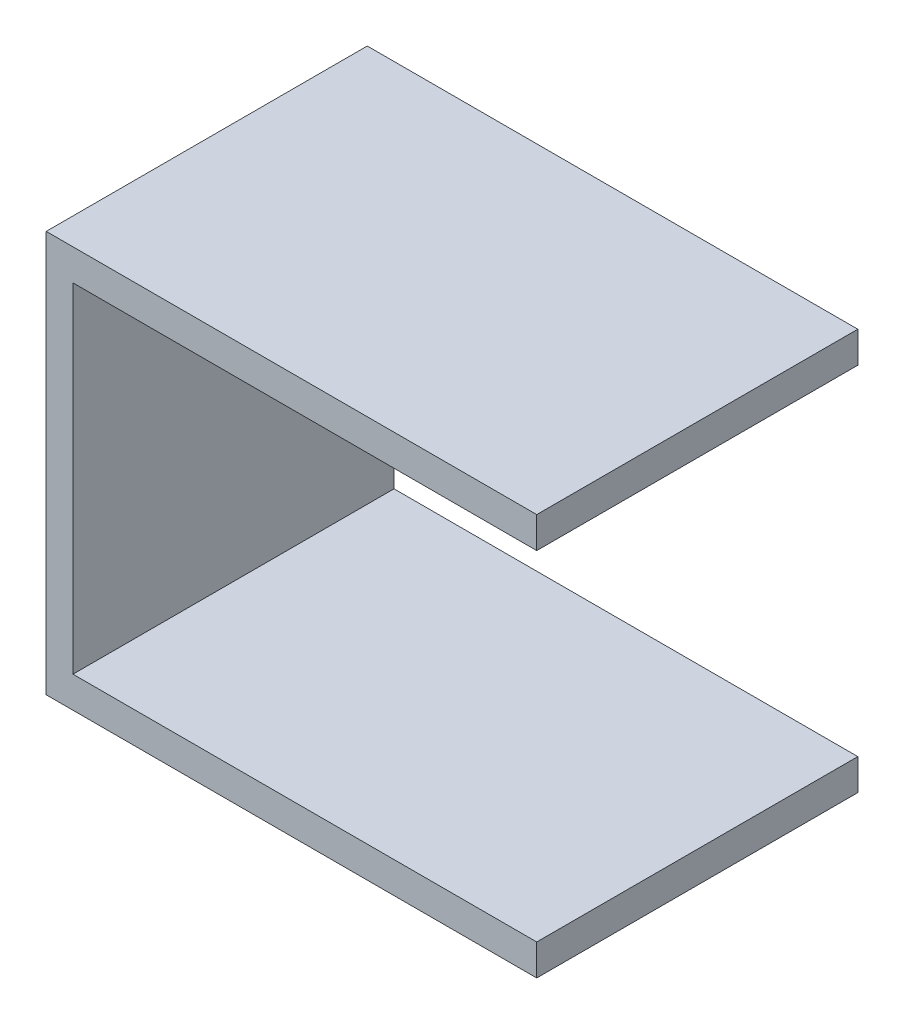
ISO-10303-21;
HEADER;
FILE_DESCRIPTION(('STEP AP214'),'2;1');
FILE_NAME('part.step','',(''),(''),'','','');
FILE_SCHEMA(('AUTOMOTIVE_DESIGN { 1 0 10303 214 1 1 1 1 }'));
ENDSEC;
DATA;
#1=APPLICATION_CONTEXT('core data for automotive mechanical design processes');
#2=APPLICATION_PROTOCOL_DEFINITION('international standard','automotive_design',2000,#1);
#3=PRODUCT_CONTEXT('',#1,'mechanical');
#4=PRODUCT('Part','Part','',(#3));
#5=PRODUCT_RELATED_PRODUCT_CATEGORY('part','',(#4));
#6=PRODUCT_DEFINITION_FORMATION('','',#4);
#7=PRODUCT_DEFINITION_CONTEXT('part definition',#1,'design');
#8=PRODUCT_DEFINITION('design','',#6,#7);
#9=PRODUCT_DEFINITION_SHAPE('','',#8);
#10=(LENGTH_UNIT() NAMED_UNIT(*) SI_UNIT(.MILLI.,.METRE.));
#11=(NAMED_UNIT(*) PLANE_ANGLE_UNIT() SI_UNIT($,.RADIAN.));
#12=(NAMED_UNIT(*) SI_UNIT($,.STERADIAN.) SOLID_ANGLE_UNIT());
#13=UNCERTAINTY_MEASURE_WITH_UNIT(LENGTH_MEASURE(1.E-05),#10,'distance_accuracy_value','');
#14=(GEOMETRIC_REPRESENTATION_CONTEXT(3) GLOBAL_UNCERTAINTY_ASSIGNED_CONTEXT((#13)) GLOBAL_UNIT_ASSIGNED_CONTEXT((#10,
#11,#12)) REPRESENTATION_CONTEXT('',''));
#15=CARTESIAN_POINT('',(0.,0.,0.));
#16=DIRECTION('',(0.,0.,1.));
#17=DIRECTION('',(1.,0.,0.));
#18=AXIS2_PLACEMENT_3D('',#15,#16,#17);
#19=CARTESIAN_POINT('',(0.,0.,36.));
#20=DIRECTION('',(0.,1.,0.));
#21=DIRECTION('',(0.,0.,1.));
#22=AXIS2_PLACEMENT_3D('',#19,#20,#21);
#23=PLANE('',#22);
#24=DIRECTION('',(1.,0.,0.));
#25=VECTOR('',#24,1.);
#26=CARTESIAN_POINT('',(0.,0.,0.));
#27=LINE('',#26,#25);
#28=CARTESIAN_POINT('',(-3.,0.,0.));
#29=VERTEX_POINT('',#28);
#30=CARTESIAN_POINT('',(52.,0.,0.));
#31=VERTEX_POINT('',#30);
#32=EDGE_CURVE('E89',#29,#31,#27,.T.);
#33=ORIENTED_EDGE('',*,*,#32,.T.);
#34=DIRECTION('',(0.,0.,-1.));
#35=VECTOR('',#34,1.);
#36=CARTESIAN_POINT('',(52.,0.,36.));
#37=LINE('',#36,#35);
#38=CARTESIAN_POINT('',(52.,0.,36.));
#39=VERTEX_POINT('',#38);
#40=EDGE_CURVE('E11',#39,#31,#37,.T.);
#41=ORIENTED_EDGE('',*,*,#40,.F.);
#42=DIRECTION('',(1.,0.,0.));
#43=VECTOR('',#42,1.);
#44=CARTESIAN_POINT('',(-3.,0.,36.));
#45=LINE('',#44,#43);
#46=CARTESIAN_POINT('',(-3.,0.,36.));
#47=VERTEX_POINT('',#46);
#48=EDGE_CURVE('E95',#47,#39,#45,.T.);
#49=ORIENTED_EDGE('',*,*,#48,.F.);
#50=DIRECTION('',(0.,0.,-1.));
#51=VECTOR('',#50,1.);
#52=CARTESIAN_POINT('',(-3.,0.,36.));
#53=LINE('',#52,#51);
#54=EDGE_CURVE('E129',#47,#29,#53,.T.);
#55=ORIENTED_EDGE('',*,*,#54,.T.);
#56=EDGE_LOOP('',(#33,#41,#49,#55));
#57=FACE_BOUND('',#56,.T.);
#58=ADVANCED_FACE('F37',(#57),#23,.F.);
#59=CARTESIAN_POINT('',(52.,0.,36.));
#60=DIRECTION('',(-1.,0.,0.));
#61=DIRECTION('',(0.,0.,1.));
#62=AXIS2_PLACEMENT_3D('',#59,#60,#61);
#63=PLANE('',#62);
#64=DIRECTION('',(0.,1.,0.));
#65=VECTOR('',#64,1.);
#66=CARTESIAN_POINT('',(52.,0.,0.));
#67=LINE('',#66,#65);
#68=CARTESIAN_POINT('',(52.,3.5,0.));
#69=VERTEX_POINT('',#68);
#70=EDGE_CURVE('E134',#31,#69,#67,.T.);
#71=ORIENTED_EDGE('',*,*,#70,.T.);
#72=DIRECTION('',(0.,0.,-1.));
#73=VECTOR('',#72,1.);
#74=CARTESIAN_POINT('',(52.,3.5,36.));
#75=LINE('',#74,#73);
#76=CARTESIAN_POINT('',(52.,3.5,36.));
#77=VERTEX_POINT('',#76);
#78=EDGE_CURVE('E45',#77,#69,#75,.T.);
#79=ORIENTED_EDGE('',*,*,#78,.F.);
#80=DIRECTION('',(0.,1.,0.));
#81=VECTOR('',#80,1.);
#82=CARTESIAN_POINT('',(52.,0.,36.));
#83=LINE('',#82,#81);
#84=EDGE_CURVE('E178',#39,#77,#83,.T.);
#85=ORIENTED_EDGE('',*,*,#84,.F.);
#86=ORIENTED_EDGE('',*,*,#40,.T.);
#87=EDGE_LOOP('',(#71,#79,#85,#86));
#88=FACE_BOUND('',#87,.T.);
#89=ADVANCED_FACE('F180',(#88),#63,.F.);
#90=CARTESIAN_POINT('',(52.,3.5,36.));
#91=DIRECTION('',(0.,-1.,0.));
#92=DIRECTION('',(1.,0.,0.));
#93=AXIS2_PLACEMENT_3D('',#90,#91,#92);
#94=PLANE('',#93);
#95=DIRECTION('',(-1.,0.,0.));
#96=VECTOR('',#95,1.);
#97=CARTESIAN_POINT('',(52.,3.5,0.));
#98=LINE('',#97,#96);
#99=CARTESIAN_POINT('',(0.,3.49999999999999,0.));
#100=VERTEX_POINT('',#99);
#101=EDGE_CURVE('E136',#69,#100,#98,.T.);
#102=ORIENTED_EDGE('',*,*,#101,.T.);
#103=DIRECTION('',(0.,0.,-1.));
#104=VECTOR('',#103,1.);
#105=CARTESIAN_POINT('',(0.,3.49999999999999,36.));
#106=LINE('',#105,#104);
#107=CARTESIAN_POINT('',(0.,3.49999999999999,36.));
#108=VERTEX_POINT('',#107);
#109=EDGE_CURVE('E153',#108,#100,#106,.T.);
#110=ORIENTED_EDGE('',*,*,#109,.F.);
#111=DIRECTION('',(-1.,0.,0.));
#112=VECTOR('',#111,1.);
#113=CARTESIAN_POINT('',(52.,3.5,36.));
#114=LINE('',#113,#112);
#115=EDGE_CURVE('E162',#77,#108,#114,.T.);
#116=ORIENTED_EDGE('',*,*,#115,.F.);
#117=ORIENTED_EDGE('',*,*,#78,.T.);
#118=EDGE_LOOP('',(#102,#110,#116,#117));
#119=FACE_BOUND('',#118,.T.);
#120=ADVANCED_FACE('F160',(#119),#94,.F.);
#121=CARTESIAN_POINT('',(0.,3.49999999999999,36.));
#122=DIRECTION('',(-1.,0.,0.));
#123=DIRECTION('',(0.,0.,1.));
#124=AXIS2_PLACEMENT_3D('',#121,#122,#123);
#125=PLANE('',#124);
#126=DIRECTION('',(0.,1.,0.));
#127=VECTOR('',#126,1.);
#128=CARTESIAN_POINT('',(0.,3.49999999999999,0.));
#129=LINE('',#128,#127);
#130=CARTESIAN_POINT('',(0.,41.5,0.));
#131=VERTEX_POINT('',#130);
#132=EDGE_CURVE('E138',#100,#131,#129,.T.);
#133=ORIENTED_EDGE('',*,*,#132,.T.);
#134=DIRECTION('',(0.,0.,-1.));
#135=VECTOR('',#134,1.);
#136=CARTESIAN_POINT('',(0.,41.5,36.));
#137=LINE('',#136,#135);
#138=CARTESIAN_POINT('',(0.,41.5,36.));
#139=VERTEX_POINT('',#138);
#140=EDGE_CURVE('E150',#139,#131,#137,.T.);
#141=ORIENTED_EDGE('',*,*,#140,.F.);
#142=DIRECTION('',(0.,1.,0.));
#143=VECTOR('',#142,1.);
#144=CARTESIAN_POINT('',(0.,3.49999999999999,36.));
#145=LINE('',#144,#143);
#146=EDGE_CURVE('E174',#108,#139,#145,.T.);
#147=ORIENTED_EDGE('',*,*,#146,.F.);
#148=ORIENTED_EDGE('',*,*,#109,.T.);
#149=EDGE_LOOP('',(#133,#141,#147,#148));
#150=FACE_BOUND('',#149,.T.);
#151=ADVANCED_FACE('F170',(#150),#125,.F.);
#152=CARTESIAN_POINT('',(0.,41.5,36.));
#153=DIRECTION('',(0.,1.,0.));
#154=DIRECTION('',(-1.,0.,0.));
#155=AXIS2_PLACEMENT_3D('',#152,#153,#154);
#156=PLANE('',#155);
#157=DIRECTION('',(1.,0.,0.));
#158=VECTOR('',#157,1.);
#159=CARTESIAN_POINT('',(0.,41.5,0.));
#160=LINE('',#159,#158);
#161=CARTESIAN_POINT('',(52.,41.5,0.));
#162=VERTEX_POINT('',#161);
#163=EDGE_CURVE('E140',#131,#162,#160,.T.);
#164=ORIENTED_EDGE('',*,*,#163,.T.);
#165=DIRECTION('',(0.,0.,-1.));
#166=VECTOR('',#165,1.);
#167=CARTESIAN_POINT('',(52.,41.5,36.));
#168=LINE('',#167,#166);
#169=CARTESIAN_POINT('',(52.,41.5,36.));
#170=VERTEX_POINT('',#169);
#171=EDGE_CURVE('E124',#170,#162,#168,.T.);
#172=ORIENTED_EDGE('',*,*,#171,.F.);
#173=DIRECTION('',(1.,0.,0.));
#174=VECTOR('',#173,1.);
#175=CARTESIAN_POINT('',(0.,41.5,36.));
#176=LINE('',#175,#174);
#177=EDGE_CURVE('E115',#139,#170,#176,.T.);
#178=ORIENTED_EDGE('',*,*,#177,.F.);
#179=ORIENTED_EDGE('',*,*,#140,.T.);
#180=EDGE_LOOP('',(#164,#172,#178,#179));
#181=FACE_BOUND('',#180,.T.);
#182=ADVANCED_FACE('F173',(#181),#156,.F.);
#183=CARTESIAN_POINT('',(52.,41.5,36.));
#184=DIRECTION('',(-1.,0.,0.));
#185=DIRECTION('',(0.,0.,1.));
#186=AXIS2_PLACEMENT_3D('',#183,#184,#185);
#187=PLANE('',#186);
#188=DIRECTION('',(0.,1.,0.));
#189=VECTOR('',#188,1.);
#190=CARTESIAN_POINT('',(52.,41.5,0.));
#191=LINE('',#190,#189);
#192=CARTESIAN_POINT('',(52.,45.,0.));
#193=VERTEX_POINT('',#192);
#194=EDGE_CURVE('E123',#162,#193,#191,.T.);
#195=ORIENTED_EDGE('',*,*,#194,.T.);
#196=DIRECTION('',(0.,0.,-1.));
#197=VECTOR('',#196,1.);
#198=CARTESIAN_POINT('',(52.,45.,36.));
#199=LINE('',#198,#197);
#200=CARTESIAN_POINT('',(52.,45.,36.));
#201=VERTEX_POINT('',#200);
#202=EDGE_CURVE('E120',#201,#193,#199,.T.);
#203=ORIENTED_EDGE('',*,*,#202,.F.);
#204=DIRECTION('',(0.,1.,0.));
#205=VECTOR('',#204,1.);
#206=CARTESIAN_POINT('',(52.,41.5,36.));
#207=LINE('',#206,#205);
#208=EDGE_CURVE('E109',#170,#201,#207,.T.);
#209=ORIENTED_EDGE('',*,*,#208,.F.);
#210=ORIENTED_EDGE('',*,*,#171,.T.);
#211=EDGE_LOOP('',(#195,#203,#209,#210));
#212=FACE_BOUND('',#211,.T.);
#213=ADVANCED_FACE('F121',(#212),#187,.F.);
#214=CARTESIAN_POINT('',(52.,45.,36.));
#215=DIRECTION('',(0.,-1.,0.));
#216=DIRECTION('',(1.,0.,0.));
#217=AXIS2_PLACEMENT_3D('',#214,#215,#216);
#218=PLANE('',#217);
#219=DIRECTION('',(-1.,0.,0.));
#220=VECTOR('',#219,1.);
#221=CARTESIAN_POINT('',(52.,45.,0.));
#222=LINE('',#221,#220);
#223=CARTESIAN_POINT('',(-3.,45.,0.));
#224=VERTEX_POINT('',#223);
#225=EDGE_CURVE('E82',#193,#224,#222,.T.);
#226=ORIENTED_EDGE('',*,*,#225,.T.);
#227=DIRECTION('',(0.,0.,-1.));
#228=VECTOR('',#227,1.);
#229=CARTESIAN_POINT('',(-3.,45.,36.));
#230=LINE('',#229,#228);
#231=CARTESIAN_POINT('',(-3.,45.,36.));
#232=VERTEX_POINT('',#231);
#233=EDGE_CURVE('E125',#232,#224,#230,.T.);
#234=ORIENTED_EDGE('',*,*,#233,.F.);
#235=DIRECTION('',(-1.,0.,0.));
#236=VECTOR('',#235,1.);
#237=CARTESIAN_POINT('',(52.,45.,36.));
#238=LINE('',#237,#236);
#239=EDGE_CURVE('E113',#201,#232,#238,.T.);
#240=ORIENTED_EDGE('',*,*,#239,.F.);
#241=ORIENTED_EDGE('',*,*,#202,.T.);
#242=EDGE_LOOP('',(#226,#234,#240,#241));
#243=FACE_BOUND('',#242,.T.);
#244=ADVANCED_FACE('F127',(#243),#218,.F.);
#245=CARTESIAN_POINT('',(-3.,45.,36.));
#246=DIRECTION('',(1.,0.,0.));
#247=DIRECTION('',(0.,1.,0.));
#248=AXIS2_PLACEMENT_3D('',#245,#246,#247);
#249=PLANE('',#248);
#250=DIRECTION('',(0.,-1.,0.));
#251=VECTOR('',#250,1.);
#252=CARTESIAN_POINT('',(-3.,45.,0.));
#253=LINE('',#252,#251);
#254=EDGE_CURVE('E144',#224,#29,#253,.T.);
#255=ORIENTED_EDGE('',*,*,#254,.T.);
#256=ORIENTED_EDGE('',*,*,#54,.F.);
#257=DIRECTION('',(0.,-1.,0.));
#258=VECTOR('',#257,1.);
#259=CARTESIAN_POINT('',(-3.,45.,36.));
#260=LINE('',#259,#258);
#261=EDGE_CURVE('E53',#232,#47,#260,.T.);
#262=ORIENTED_EDGE('',*,*,#261,.F.);
#263=ORIENTED_EDGE('',*,*,#233,.T.);
#264=EDGE_LOOP('',(#255,#256,#262,#263));
#265=FACE_BOUND('',#264,.T.);
#266=ADVANCED_FACE('F183',(#265),#249,.F.);
#267=CARTESIAN_POINT('',(0.,0.,36.));
#268=DIRECTION('',(0.,0.,1.));
#269=DIRECTION('',(1.,0.,0.));
#270=AXIS2_PLACEMENT_3D('',#267,#268,#269);
#271=PLANE('',#270);
#272=ORIENTED_EDGE('',*,*,#48,.T.);
#273=ORIENTED_EDGE('',*,*,#84,.T.);
#274=ORIENTED_EDGE('',*,*,#115,.T.);
#275=ORIENTED_EDGE('',*,*,#146,.T.);
#276=ORIENTED_EDGE('',*,*,#177,.T.);
#277=ORIENTED_EDGE('',*,*,#208,.T.);
#278=ORIENTED_EDGE('',*,*,#239,.T.);
#279=ORIENTED_EDGE('',*,*,#261,.T.);
#280=EDGE_LOOP('',(#272,#273,#274,#275,#276,#277,#278,#279));
#281=FACE_BOUND('',#280,.T.);
#282=ADVANCED_FACE('F111',(#281),#271,.T.);
#283=CARTESIAN_POINT('',(0.,0.,0.));
#284=DIRECTION('',(0.,0.,1.));
#285=DIRECTION('',(1.,0.,0.));
#286=AXIS2_PLACEMENT_3D('',#283,#284,#285);
#287=PLANE('',#286);
#288=ORIENTED_EDGE('',*,*,#32,.F.);
#289=ORIENTED_EDGE('',*,*,#254,.F.);
#290=ORIENTED_EDGE('',*,*,#225,.F.);
#291=ORIENTED_EDGE('',*,*,#194,.F.);
#292=ORIENTED_EDGE('',*,*,#163,.F.);
#293=ORIENTED_EDGE('',*,*,#132,.F.);
#294=ORIENTED_EDGE('',*,*,#101,.F.);
#295=ORIENTED_EDGE('',*,*,#70,.F.);
#296=EDGE_LOOP('',(#288,#289,#290,#291,#292,#293,#294,#295));
#297=FACE_BOUND('',#296,.T.);
#298=ADVANCED_FACE('F166',(#297),#287,.F.);
#299=CLOSED_SHELL('',(#58,#89,#120,#151,#182,#213,#244,#266,#282,#298));
#300=MANIFOLD_SOLID_BREP('B2',#299);
#301=ADVANCED_BREP_SHAPE_REPRESENTATION('',(#18,#300),#14);
#302=SHAPE_DEFINITION_REPRESENTATION(#9,#301);
ENDSEC;
END-ISO-10303-21;
